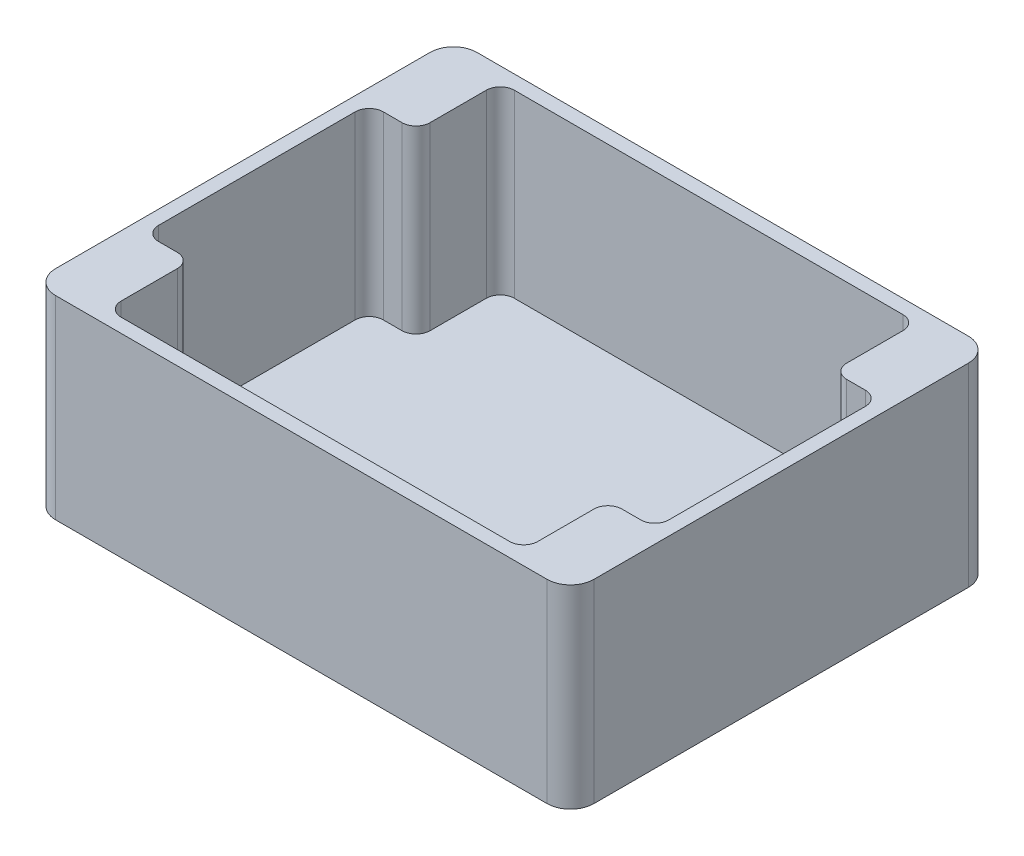
ISO-10303-21;
HEADER;
FILE_DESCRIPTION(('STEP AP214'),'2;1');
FILE_NAME('part.step','',(''),(''),'','','');
FILE_SCHEMA(('AUTOMOTIVE_DESIGN { 1 0 10303 214 1 1 1 1 }'));
ENDSEC;
DATA;
#1=APPLICATION_CONTEXT('core data for automotive mechanical design processes');
#2=APPLICATION_PROTOCOL_DEFINITION('international standard','automotive_design',2000,#1);
#3=PRODUCT_CONTEXT('',#1,'mechanical');
#4=PRODUCT('Part','Part','',(#3));
#5=PRODUCT_RELATED_PRODUCT_CATEGORY('part','',(#4));
#6=PRODUCT_DEFINITION_FORMATION('','',#4);
#7=PRODUCT_DEFINITION_CONTEXT('part definition',#1,'design');
#8=PRODUCT_DEFINITION('design','',#6,#7);
#9=PRODUCT_DEFINITION_SHAPE('','',#8);
#10=(LENGTH_UNIT() NAMED_UNIT(*) SI_UNIT(.MILLI.,.METRE.));
#11=(NAMED_UNIT(*) PLANE_ANGLE_UNIT() SI_UNIT($,.RADIAN.));
#12=(NAMED_UNIT(*) SI_UNIT($,.STERADIAN.) SOLID_ANGLE_UNIT());
#13=UNCERTAINTY_MEASURE_WITH_UNIT(LENGTH_MEASURE(1.E-05),#10,'distance_accuracy_value','');
#14=(GEOMETRIC_REPRESENTATION_CONTEXT(3) GLOBAL_UNCERTAINTY_ASSIGNED_CONTEXT((#13)) GLOBAL_UNIT_ASSIGNED_CONTEXT((#10,
#11,#12)) REPRESENTATION_CONTEXT('',''));
#15=CARTESIAN_POINT('',(0.,0.,0.));
#16=DIRECTION('',(0.,0.,1.));
#17=DIRECTION('',(1.,0.,0.));
#18=AXIS2_PLACEMENT_3D('',#15,#16,#17);
#19=CARTESIAN_POINT('',(0.,3.,0.));
#20=DIRECTION('',(0.,-1.,0.));
#21=DIRECTION('',(0.,0.,-1.));
#22=AXIS2_PLACEMENT_3D('',#19,#20,#21);
#23=PLANE('',#22);
#24=DIRECTION('',(-1.,0.,0.));
#25=VECTOR('',#24,1.);
#26=CARTESIAN_POINT('',(112.,3.,-21.));
#27=LINE('',#26,#25);
#28=CARTESIAN_POINT('',(109.,3.,-21.));
#29=VERTEX_POINT('',#28);
#30=CARTESIAN_POINT('',(105.,3.,-21.));
#31=VERTEX_POINT('',#30);
#32=EDGE_CURVE('E268',#29,#31,#27,.T.);
#33=ORIENTED_EDGE('',*,*,#32,.F.);
#34=CARTESIAN_POINT('',(109.,3.,-24.));
#35=DIRECTION('',(0.,-1.,0.));
#36=DIRECTION('',(0.,0.,-1.));
#37=AXIS2_PLACEMENT_3D('',#34,#35,#36);
#38=CIRCLE('',#37,3.);
#39=CARTESIAN_POINT('',(112.,3.,-24.));
#40=VERTEX_POINT('',#39);
#41=EDGE_CURVE('E507',#29,#40,#38,.F.);
#42=ORIENTED_EDGE('',*,*,#41,.T.);
#43=DIRECTION('',(0.,0.,-1.));
#44=VECTOR('',#43,1.);
#45=CARTESIAN_POINT('',(112.,3.,-3.));
#46=LINE('',#45,#44);
#47=CARTESIAN_POINT('',(112.,3.,-66.));
#48=VERTEX_POINT('',#47);
#49=EDGE_CURVE('E580',#40,#48,#46,.T.);
#50=ORIENTED_EDGE('',*,*,#49,.T.);
#51=CARTESIAN_POINT('',(109.,3.,-66.));
#52=DIRECTION('',(0.,-1.,0.));
#53=DIRECTION('',(0.,0.,-1.));
#54=AXIS2_PLACEMENT_3D('',#51,#52,#53);
#55=CIRCLE('',#54,3.);
#56=CARTESIAN_POINT('',(109.,3.,-69.));
#57=VERTEX_POINT('',#56);
#58=EDGE_CURVE('E495',#48,#57,#55,.F.);
#59=ORIENTED_EDGE('',*,*,#58,.T.);
#60=DIRECTION('',(1.,0.,0.));
#61=VECTOR('',#60,1.);
#62=CARTESIAN_POINT('',(112.,3.,-69.));
#63=LINE('',#62,#61);
#64=CARTESIAN_POINT('',(105.,3.,-69.));
#65=VERTEX_POINT('',#64);
#66=EDGE_CURVE('E542',#65,#57,#63,.T.);
#67=ORIENTED_EDGE('',*,*,#66,.F.);
#68=CARTESIAN_POINT('',(105.,3.,-72.));
#69=DIRECTION('',(0.,-1.,0.));
#70=DIRECTION('',(0.,0.,-1.));
#71=AXIS2_PLACEMENT_3D('',#68,#69,#70);
#72=CIRCLE('',#71,3.);
#73=CARTESIAN_POINT('',(102.,3.,-72.));
#74=VERTEX_POINT('',#73);
#75=EDGE_CURVE('E382',#65,#74,#72,.T.);
#76=ORIENTED_EDGE('',*,*,#75,.T.);
#77=DIRECTION('',(0.,0.,1.));
#78=VECTOR('',#77,1.);
#79=CARTESIAN_POINT('',(102.,3.,-87.));
#80=LINE('',#79,#78);
#81=CARTESIAN_POINT('',(102.,3.,-84.));
#82=VERTEX_POINT('',#81);
#83=EDGE_CURVE('E548',#82,#74,#80,.T.);
#84=ORIENTED_EDGE('',*,*,#83,.F.);
#85=CARTESIAN_POINT('',(99.,3.,-84.));
#86=DIRECTION('',(0.,-1.,0.));
#87=DIRECTION('',(0.,0.,-1.));
#88=AXIS2_PLACEMENT_3D('',#85,#86,#87);
#89=CIRCLE('',#88,3.);
#90=CARTESIAN_POINT('',(99.,3.,-87.));
#91=VERTEX_POINT('',#90);
#92=EDGE_CURVE('E492',#82,#91,#89,.F.);
#93=ORIENTED_EDGE('',*,*,#92,.T.);
#94=DIRECTION('',(-1.,0.,0.));
#95=VECTOR('',#94,1.);
#96=CARTESIAN_POINT('',(112.,3.,-87.));
#97=LINE('',#96,#95);
#98=CARTESIAN_POINT('',(16.,3.,-87.));
#99=VERTEX_POINT('',#98);
#100=EDGE_CURVE('E595',#91,#99,#97,.T.);
#101=ORIENTED_EDGE('',*,*,#100,.T.);
#102=CARTESIAN_POINT('',(16.,3.,-84.));
#103=DIRECTION('',(0.,-1.,0.));
#104=DIRECTION('',(0.,0.,-1.));
#105=AXIS2_PLACEMENT_3D('',#102,#103,#104);
#106=CIRCLE('',#105,3.);
#107=CARTESIAN_POINT('',(13.,3.,-84.));
#108=VERTEX_POINT('',#107);
#109=EDGE_CURVE('E489',#99,#108,#106,.F.);
#110=ORIENTED_EDGE('',*,*,#109,.T.);
#111=DIRECTION('',(0.,0.,-1.));
#112=VECTOR('',#111,1.);
#113=CARTESIAN_POINT('',(13.,3.,-87.));
#114=LINE('',#113,#112);
#115=CARTESIAN_POINT('',(13.,3.,-72.));
#116=VERTEX_POINT('',#115);
#117=EDGE_CURVE('E558',#116,#108,#114,.T.);
#118=ORIENTED_EDGE('',*,*,#117,.F.);
#119=CARTESIAN_POINT('',(10.,3.,-72.));
#120=DIRECTION('',(0.,-1.,0.));
#121=DIRECTION('',(0.,0.,-1.));
#122=AXIS2_PLACEMENT_3D('',#119,#120,#121);
#123=CIRCLE('',#122,3.);
#124=CARTESIAN_POINT('',(10.,3.,-69.));
#125=VERTEX_POINT('',#124);
#126=EDGE_CURVE('E394',#116,#125,#123,.T.);
#127=ORIENTED_EDGE('',*,*,#126,.T.);
#128=DIRECTION('',(1.,0.,0.));
#129=VECTOR('',#128,1.);
#130=CARTESIAN_POINT('',(3.,3.,-69.));
#131=LINE('',#130,#129);
#132=CARTESIAN_POINT('',(6.,3.,-69.));
#133=VERTEX_POINT('',#132);
#134=EDGE_CURVE('E553',#133,#125,#131,.T.);
#135=ORIENTED_EDGE('',*,*,#134,.F.);
#136=CARTESIAN_POINT('',(6.,3.,-66.));
#137=DIRECTION('',(0.,-1.,0.));
#138=DIRECTION('',(0.,0.,-1.));
#139=AXIS2_PLACEMENT_3D('',#136,#137,#138);
#140=CIRCLE('',#139,3.);
#141=CARTESIAN_POINT('',(3.,3.,-66.));
#142=VERTEX_POINT('',#141);
#143=EDGE_CURVE('E486',#133,#142,#140,.F.);
#144=ORIENTED_EDGE('',*,*,#143,.T.);
#145=DIRECTION('',(0.,0.,1.));
#146=VECTOR('',#145,1.);
#147=CARTESIAN_POINT('',(3.,3.,-87.));
#148=LINE('',#147,#146);
#149=CARTESIAN_POINT('',(3.,3.,-24.));
#150=VERTEX_POINT('',#149);
#151=EDGE_CURVE('E599',#142,#150,#148,.T.);
#152=ORIENTED_EDGE('',*,*,#151,.T.);
#153=CARTESIAN_POINT('',(6.,3.,-24.));
#154=DIRECTION('',(0.,-1.,0.));
#155=DIRECTION('',(0.,0.,-1.));
#156=AXIS2_PLACEMENT_3D('',#153,#154,#155);
#157=CIRCLE('',#156,3.);
#158=CARTESIAN_POINT('',(6.,3.,-21.));
#159=VERTEX_POINT('',#158);
#160=EDGE_CURVE('E498',#150,#159,#157,.F.);
#161=ORIENTED_EDGE('',*,*,#160,.T.);
#162=DIRECTION('',(-1.,0.,0.));
#163=VECTOR('',#162,1.);
#164=CARTESIAN_POINT('',(3.,3.,-21.));
#165=LINE('',#164,#163);
#166=CARTESIAN_POINT('',(10.,3.,-21.));
#167=VERTEX_POINT('',#166);
#168=EDGE_CURVE('E733',#167,#159,#165,.T.);
#169=ORIENTED_EDGE('',*,*,#168,.F.);
#170=CARTESIAN_POINT('',(10.,3.,-18.));
#171=DIRECTION('',(0.,-1.,0.));
#172=DIRECTION('',(0.,0.,-1.));
#173=AXIS2_PLACEMENT_3D('',#170,#171,#172);
#174=CIRCLE('',#173,3.);
#175=CARTESIAN_POINT('',(13.,3.,-18.));
#176=VERTEX_POINT('',#175);
#177=EDGE_CURVE('E376',#167,#176,#174,.T.);
#178=ORIENTED_EDGE('',*,*,#177,.T.);
#179=DIRECTION('',(0.,0.,-1.));
#180=VECTOR('',#179,1.);
#181=CARTESIAN_POINT('',(13.,3.,-3.));
#182=LINE('',#181,#180);
#183=CARTESIAN_POINT('',(13.,3.,-6.));
#184=VERTEX_POINT('',#183);
#185=EDGE_CURVE('E285',#184,#176,#182,.T.);
#186=ORIENTED_EDGE('',*,*,#185,.F.);
#187=CARTESIAN_POINT('',(16.,3.,-6.));
#188=DIRECTION('',(0.,-1.,0.));
#189=DIRECTION('',(0.,0.,-1.));
#190=AXIS2_PLACEMENT_3D('',#187,#188,#189);
#191=CIRCLE('',#190,3.);
#192=CARTESIAN_POINT('',(16.,3.,-3.));
#193=VERTEX_POINT('',#192);
#194=EDGE_CURVE('E501',#184,#193,#191,.F.);
#195=ORIENTED_EDGE('',*,*,#194,.T.);
#196=DIRECTION('',(1.,0.,0.));
#197=VECTOR('',#196,1.);
#198=CARTESIAN_POINT('',(3.,3.,-3.));
#199=LINE('',#198,#197);
#200=CARTESIAN_POINT('',(99.,3.,-3.));
#201=VERTEX_POINT('',#200);
#202=EDGE_CURVE('E478',#193,#201,#199,.T.);
#203=ORIENTED_EDGE('',*,*,#202,.T.);
#204=CARTESIAN_POINT('',(99.,3.,-6.));
#205=DIRECTION('',(0.,-1.,0.));
#206=DIRECTION('',(0.,0.,-1.));
#207=AXIS2_PLACEMENT_3D('',#204,#205,#206);
#208=CIRCLE('',#207,3.);
#209=CARTESIAN_POINT('',(102.,3.,-6.));
#210=VERTEX_POINT('',#209);
#211=EDGE_CURVE('E504',#201,#210,#208,.F.);
#212=ORIENTED_EDGE('',*,*,#211,.T.);
#213=DIRECTION('',(0.,0.,1.));
#214=VECTOR('',#213,1.);
#215=CARTESIAN_POINT('',(102.,3.,-3.));
#216=LINE('',#215,#214);
#217=CARTESIAN_POINT('',(102.,3.,-18.));
#218=VERTEX_POINT('',#217);
#219=EDGE_CURVE('E754',#218,#210,#216,.T.);
#220=ORIENTED_EDGE('',*,*,#219,.F.);
#221=CARTESIAN_POINT('',(105.,3.,-18.));
#222=DIRECTION('',(0.,-1.,0.));
#223=DIRECTION('',(0.,0.,-1.));
#224=AXIS2_PLACEMENT_3D('',#221,#222,#223);
#225=CIRCLE('',#224,3.);
#226=EDGE_CURVE('E364',#218,#31,#225,.T.);
#227=ORIENTED_EDGE('',*,*,#226,.T.);
#228=EDGE_LOOP('',(#33,#42,#50,#59,#67,#76,#84,#93,#101,#110,#118,#127,#135,#144,#152,#161,#169,
#178,#186,#195,#203,#212,#220,#227));
#229=FACE_BOUND('',#228,.T.);
#230=ADVANCED_FACE('F49',(#229),#23,.F.);
#231=CARTESIAN_POINT('',(3.,-137.611772752189,-3.));
#232=DIRECTION('',(0.,0.,1.));
#233=DIRECTION('',(1.,0.,0.));
#234=AXIS2_PLACEMENT_3D('',#231,#232,#233);
#235=PLANE('',#234);
#236=DIRECTION('',(1.,0.,0.));
#237=VECTOR('',#236,1.);
#238=CARTESIAN_POINT('',(3.,41.5,-3.));
#239=LINE('',#238,#237);
#240=CARTESIAN_POINT('',(16.,41.5,-3.));
#241=VERTEX_POINT('',#240);
#242=CARTESIAN_POINT('',(99.,41.5,-3.));
#243=VERTEX_POINT('',#242);
#244=EDGE_CURVE('E571',#241,#243,#239,.T.);
#245=ORIENTED_EDGE('',*,*,#244,.T.);
#246=DIRECTION('',(0.,-1.,0.));
#247=VECTOR('',#246,1.);
#248=CARTESIAN_POINT('',(99.,3.,-3.));
#249=LINE('',#248,#247);
#250=EDGE_CURVE('E297',#243,#201,#249,.T.);
#251=ORIENTED_EDGE('',*,*,#250,.T.);
#252=ORIENTED_EDGE('',*,*,#202,.F.);
#253=DIRECTION('',(0.,-1.,0.));
#254=VECTOR('',#253,1.);
#255=CARTESIAN_POINT('',(16.,41.5,-3.));
#256=LINE('',#255,#254);
#257=EDGE_CURVE('E292',#193,#241,#256,.F.);
#258=ORIENTED_EDGE('',*,*,#257,.T.);
#259=EDGE_LOOP('',(#245,#251,#252,#258));
#260=FACE_BOUND('',#259,.T.);
#261=ADVANCED_FACE('F638',(#260),#235,.F.);
#262=CARTESIAN_POINT('',(3.,-137.611772752189,-87.));
#263=DIRECTION('',(-1.,0.,0.));
#264=DIRECTION('',(0.,0.,1.));
#265=AXIS2_PLACEMENT_3D('',#262,#263,#264);
#266=PLANE('',#265);
#267=DIRECTION('',(0.,0.,1.));
#268=VECTOR('',#267,1.);
#269=CARTESIAN_POINT('',(3.,41.5,-87.));
#270=LINE('',#269,#268);
#271=CARTESIAN_POINT('',(3.,41.5,-66.));
#272=VERTEX_POINT('',#271);
#273=CARTESIAN_POINT('',(3.,41.5,-24.));
#274=VERTEX_POINT('',#273);
#275=EDGE_CURVE('E576',#272,#274,#270,.T.);
#276=ORIENTED_EDGE('',*,*,#275,.T.);
#277=DIRECTION('',(0.,-1.,0.));
#278=VECTOR('',#277,1.);
#279=CARTESIAN_POINT('',(3.,3.,-24.));
#280=LINE('',#279,#278);
#281=EDGE_CURVE('E316',#274,#150,#280,.T.);
#282=ORIENTED_EDGE('',*,*,#281,.T.);
#283=ORIENTED_EDGE('',*,*,#151,.F.);
#284=DIRECTION('',(0.,-1.,0.));
#285=VECTOR('',#284,1.);
#286=CARTESIAN_POINT('',(3.,41.5,-66.));
#287=LINE('',#286,#285);
#288=EDGE_CURVE('E313',#142,#272,#287,.F.);
#289=ORIENTED_EDGE('',*,*,#288,.T.);
#290=EDGE_LOOP('',(#276,#282,#283,#289));
#291=FACE_BOUND('',#290,.T.);
#292=ADVANCED_FACE('F643',(#291),#266,.F.);
#293=CARTESIAN_POINT('',(112.,-137.611772752189,-3.));
#294=DIRECTION('',(1.,0.,0.));
#295=DIRECTION('',(0.,0.,-1.));
#296=AXIS2_PLACEMENT_3D('',#293,#294,#295);
#297=PLANE('',#296);
#298=ORIENTED_EDGE('',*,*,#49,.F.);
#299=DIRECTION('',(0.,-1.,0.));
#300=VECTOR('',#299,1.);
#301=CARTESIAN_POINT('',(112.,41.5,-24.));
#302=LINE('',#301,#300);
#303=CARTESIAN_POINT('',(112.,41.5,-24.));
#304=VERTEX_POINT('',#303);
#305=EDGE_CURVE('E514',#40,#304,#302,.F.);
#306=ORIENTED_EDGE('',*,*,#305,.T.);
#307=DIRECTION('',(0.,0.,-1.));
#308=VECTOR('',#307,1.);
#309=CARTESIAN_POINT('',(112.,41.5,-3.));
#310=LINE('',#309,#308);
#311=CARTESIAN_POINT('',(112.,41.5,-66.));
#312=VERTEX_POINT('',#311);
#313=EDGE_CURVE('E585',#304,#312,#310,.T.);
#314=ORIENTED_EDGE('',*,*,#313,.T.);
#315=DIRECTION('',(0.,-1.,0.));
#316=VECTOR('',#315,1.);
#317=CARTESIAN_POINT('',(112.,3.,-66.));
#318=LINE('',#317,#316);
#319=EDGE_CURVE('E510',#312,#48,#318,.T.);
#320=ORIENTED_EDGE('',*,*,#319,.T.);
#321=EDGE_LOOP('',(#298,#306,#314,#320));
#322=FACE_BOUND('',#321,.T.);
#323=ADVANCED_FACE('F648',(#322),#297,.F.);
#324=CARTESIAN_POINT('',(112.,-137.611772752189,-87.));
#325=DIRECTION('',(0.,0.,-1.));
#326=DIRECTION('',(-1.,0.,0.));
#327=AXIS2_PLACEMENT_3D('',#324,#325,#326);
#328=PLANE('',#327);
#329=ORIENTED_EDGE('',*,*,#100,.F.);
#330=DIRECTION('',(0.,-1.,0.));
#331=VECTOR('',#330,1.);
#332=CARTESIAN_POINT('',(99.,41.5,-87.));
#333=LINE('',#332,#331);
#334=CARTESIAN_POINT('',(99.,41.5,-87.));
#335=VERTEX_POINT('',#334);
#336=EDGE_CURVE('E345',#91,#335,#333,.F.);
#337=ORIENTED_EDGE('',*,*,#336,.T.);
#338=DIRECTION('',(-1.,0.,0.));
#339=VECTOR('',#338,1.);
#340=CARTESIAN_POINT('',(112.,41.5,-87.));
#341=LINE('',#340,#339);
#342=CARTESIAN_POINT('',(16.,41.5,-87.));
#343=VERTEX_POINT('',#342);
#344=EDGE_CURVE('E581',#335,#343,#341,.T.);
#345=ORIENTED_EDGE('',*,*,#344,.T.);
#346=DIRECTION('',(0.,-1.,0.));
#347=VECTOR('',#346,1.);
#348=CARTESIAN_POINT('',(16.,3.,-87.));
#349=LINE('',#348,#347);
#350=EDGE_CURVE('E341',#343,#99,#349,.T.);
#351=ORIENTED_EDGE('',*,*,#350,.T.);
#352=EDGE_LOOP('',(#329,#337,#345,#351));
#353=FACE_BOUND('',#352,.T.);
#354=ADVANCED_FACE('F662',(#353),#328,.F.);
#355=CARTESIAN_POINT('',(0.,41.5,0.));
#356=DIRECTION('',(1.,0.,0.));
#357=DIRECTION('',(0.,0.,-1.));
#358=AXIS2_PLACEMENT_3D('',#355,#356,#357);
#359=PLANE('',#358);
#360=DIRECTION('',(0.,0.,1.));
#361=VECTOR('',#360,1.);
#362=CARTESIAN_POINT('',(0.,0.,0.));
#363=LINE('',#362,#361);
#364=CARTESIAN_POINT('',(0.,0.,-85.));
#365=VERTEX_POINT('',#364);
#366=CARTESIAN_POINT('',(0.,0.,-5.));
#367=VERTEX_POINT('',#366);
#368=EDGE_CURVE('E450',#365,#367,#363,.T.);
#369=ORIENTED_EDGE('',*,*,#368,.T.);
#370=DIRECTION('',(0.,-1.,0.));
#371=VECTOR('',#370,1.);
#372=CARTESIAN_POINT('',(0.,41.5,-5.));
#373=LINE('',#372,#371);
#374=CARTESIAN_POINT('',(0.,41.5,-5.));
#375=VERTEX_POINT('',#374);
#376=EDGE_CURVE('E438',#367,#375,#373,.F.);
#377=ORIENTED_EDGE('',*,*,#376,.T.);
#378=DIRECTION('',(0.,0.,1.));
#379=VECTOR('',#378,1.);
#380=CARTESIAN_POINT('',(0.,41.5,0.));
#381=LINE('',#380,#379);
#382=CARTESIAN_POINT('',(0.,41.5,-85.));
#383=VERTEX_POINT('',#382);
#384=EDGE_CURVE('E447',#383,#375,#381,.T.);
#385=ORIENTED_EDGE('',*,*,#384,.F.);
#386=DIRECTION('',(0.,-1.,0.));
#387=VECTOR('',#386,1.);
#388=CARTESIAN_POINT('',(0.,41.5,-85.));
#389=LINE('',#388,#387);
#390=EDGE_CURVE('E434',#383,#365,#389,.T.);
#391=ORIENTED_EDGE('',*,*,#390,.T.);
#392=EDGE_LOOP('',(#369,#377,#385,#391));
#393=FACE_BOUND('',#392,.T.);
#394=ADVANCED_FACE('F446',(#393),#359,.F.);
#395=CARTESIAN_POINT('',(0.,41.5,0.));
#396=DIRECTION('',(0.,0.,-1.));
#397=DIRECTION('',(-1.,0.,0.));
#398=AXIS2_PLACEMENT_3D('',#395,#396,#397);
#399=PLANE('',#398);
#400=DIRECTION('',(1.,0.,0.));
#401=VECTOR('',#400,1.);
#402=CARTESIAN_POINT('',(0.,0.,0.));
#403=LINE('',#402,#401);
#404=CARTESIAN_POINT('',(5.,0.,0.));
#405=VERTEX_POINT('',#404);
#406=CARTESIAN_POINT('',(110.,0.,0.));
#407=VERTEX_POINT('',#406);
#408=EDGE_CURVE('E466',#405,#407,#403,.T.);
#409=ORIENTED_EDGE('',*,*,#408,.T.);
#410=DIRECTION('',(0.,-1.,0.));
#411=VECTOR('',#410,1.);
#412=CARTESIAN_POINT('',(110.,41.5,0.));
#413=LINE('',#412,#411);
#414=CARTESIAN_POINT('',(110.,41.5,0.));
#415=VERTEX_POINT('',#414);
#416=EDGE_CURVE('E420',#407,#415,#413,.F.);
#417=ORIENTED_EDGE('',*,*,#416,.T.);
#418=DIRECTION('',(1.,0.,0.));
#419=VECTOR('',#418,1.);
#420=CARTESIAN_POINT('',(0.,41.5,0.));
#421=LINE('',#420,#419);
#422=CARTESIAN_POINT('',(5.,41.5,0.));
#423=VERTEX_POINT('',#422);
#424=EDGE_CURVE('E457',#423,#415,#421,.T.);
#425=ORIENTED_EDGE('',*,*,#424,.F.);
#426=DIRECTION('',(0.,-1.,0.));
#427=VECTOR('',#426,1.);
#428=CARTESIAN_POINT('',(5.,41.5,0.));
#429=LINE('',#428,#427);
#430=EDGE_CURVE('E416',#423,#405,#429,.T.);
#431=ORIENTED_EDGE('',*,*,#430,.T.);
#432=EDGE_LOOP('',(#409,#417,#425,#431));
#433=FACE_BOUND('',#432,.T.);
#434=ADVANCED_FACE('F465',(#433),#399,.F.);
#435=CARTESIAN_POINT('',(115.,41.5,0.));
#436=DIRECTION('',(-1.,0.,0.));
#437=DIRECTION('',(0.,0.,1.));
#438=AXIS2_PLACEMENT_3D('',#435,#436,#437);
#439=PLANE('',#438);
#440=DIRECTION('',(0.,0.,-1.));
#441=VECTOR('',#440,1.);
#442=CARTESIAN_POINT('',(115.,41.5,0.));
#443=LINE('',#442,#441);
#444=CARTESIAN_POINT('',(115.,41.5,-5.));
#445=VERTEX_POINT('',#444);
#446=CARTESIAN_POINT('',(115.,41.5,-85.));
#447=VERTEX_POINT('',#446);
#448=EDGE_CURVE('E608',#445,#447,#443,.T.);
#449=ORIENTED_EDGE('',*,*,#448,.F.);
#450=DIRECTION('',(0.,-1.,0.));
#451=VECTOR('',#450,1.);
#452=CARTESIAN_POINT('',(115.,41.5,-5.));
#453=LINE('',#452,#451);
#454=CARTESIAN_POINT('',(115.,0.,-5.));
#455=VERTEX_POINT('',#454);
#456=EDGE_CURVE('E400',#445,#455,#453,.T.);
#457=ORIENTED_EDGE('',*,*,#456,.T.);
#458=DIRECTION('',(0.,0.,-1.));
#459=VECTOR('',#458,1.);
#460=CARTESIAN_POINT('',(115.,0.,0.));
#461=LINE('',#460,#459);
#462=CARTESIAN_POINT('',(115.,0.,-85.));
#463=VERTEX_POINT('',#462);
#464=EDGE_CURVE('E472',#455,#463,#461,.T.);
#465=ORIENTED_EDGE('',*,*,#464,.T.);
#466=DIRECTION('',(0.,-1.,0.));
#467=VECTOR('',#466,1.);
#468=CARTESIAN_POINT('',(115.,41.5,-85.));
#469=LINE('',#468,#467);
#470=EDGE_CURVE('E397',#463,#447,#469,.F.);
#471=ORIENTED_EDGE('',*,*,#470,.T.);
#472=EDGE_LOOP('',(#449,#457,#465,#471));
#473=FACE_BOUND('',#472,.T.);
#474=ADVANCED_FACE('F620',(#473),#439,.F.);
#475=CARTESIAN_POINT('',(0.,41.5,-90.));
#476=DIRECTION('',(0.,0.,1.));
#477=DIRECTION('',(1.,0.,0.));
#478=AXIS2_PLACEMENT_3D('',#475,#476,#477);
#479=PLANE('',#478);
#480=DIRECTION('',(-1.,0.,0.));
#481=VECTOR('',#480,1.);
#482=CARTESIAN_POINT('',(0.,41.5,-90.));
#483=LINE('',#482,#481);
#484=CARTESIAN_POINT('',(110.,41.5,-90.));
#485=VERTEX_POINT('',#484);
#486=CARTESIAN_POINT('',(5.,41.5,-90.));
#487=VERTEX_POINT('',#486);
#488=EDGE_CURVE('E273',#485,#487,#483,.T.);
#489=ORIENTED_EDGE('',*,*,#488,.F.);
#490=DIRECTION('',(0.,-1.,0.));
#491=VECTOR('',#490,1.);
#492=CARTESIAN_POINT('',(110.,41.5,-90.));
#493=LINE('',#492,#491);
#494=CARTESIAN_POINT('',(110.,0.,-90.));
#495=VERTEX_POINT('',#494);
#496=EDGE_CURVE('E12',#485,#495,#493,.T.);
#497=ORIENTED_EDGE('',*,*,#496,.T.);
#498=DIRECTION('',(-1.,0.,0.));
#499=VECTOR('',#498,1.);
#500=CARTESIAN_POINT('',(0.,0.,-90.));
#501=LINE('',#500,#499);
#502=CARTESIAN_POINT('',(5.,0.,-90.));
#503=VERTEX_POINT('',#502);
#504=EDGE_CURVE('E458',#495,#503,#501,.T.);
#505=ORIENTED_EDGE('',*,*,#504,.T.);
#506=DIRECTION('',(0.,-1.,0.));
#507=VECTOR('',#506,1.);
#508=CARTESIAN_POINT('',(5.,41.5,-90.));
#509=LINE('',#508,#507);
#510=EDGE_CURVE('E58',#503,#487,#509,.F.);
#511=ORIENTED_EDGE('',*,*,#510,.T.);
#512=EDGE_LOOP('',(#489,#497,#505,#511));
#513=FACE_BOUND('',#512,.T.);
#514=ADVANCED_FACE('F614',(#513),#479,.F.);
#515=CARTESIAN_POINT('',(0.,41.5,0.));
#516=DIRECTION('',(0.,-1.,0.));
#517=DIRECTION('',(0.,0.,-1.));
#518=AXIS2_PLACEMENT_3D('',#515,#516,#517);
#519=PLANE('',#518);
#520=DIRECTION('',(1.,0.,0.));
#521=VECTOR('',#520,1.);
#522=CARTESIAN_POINT('',(112.,41.5,-21.));
#523=LINE('',#522,#521);
#524=CARTESIAN_POINT('',(105.,41.5,-21.));
#525=VERTEX_POINT('',#524);
#526=CARTESIAN_POINT('',(109.,41.5,-21.));
#527=VERTEX_POINT('',#526);
#528=EDGE_CURVE('E265',#525,#527,#523,.T.);
#529=ORIENTED_EDGE('',*,*,#528,.F.);
#530=CARTESIAN_POINT('',(105.,41.5,-18.));
#531=DIRECTION('',(0.,-1.,0.));
#532=DIRECTION('',(0.,0.,-1.));
#533=AXIS2_PLACEMENT_3D('',#530,#531,#532);
#534=CIRCLE('',#533,3.);
#535=CARTESIAN_POINT('',(102.,41.5,-18.));
#536=VERTEX_POINT('',#535);
#537=EDGE_CURVE('E278',#525,#536,#534,.F.);
#538=ORIENTED_EDGE('',*,*,#537,.T.);
#539=DIRECTION('',(0.,0.,-1.));
#540=VECTOR('',#539,1.);
#541=CARTESIAN_POINT('',(102.,41.5,-3.));
#542=LINE('',#541,#540);
#543=CARTESIAN_POINT('',(102.,41.5,-6.));
#544=VERTEX_POINT('',#543);
#545=EDGE_CURVE('E284',#544,#536,#542,.T.);
#546=ORIENTED_EDGE('',*,*,#545,.F.);
#547=CARTESIAN_POINT('',(99.,41.5,-6.));
#548=DIRECTION('',(0.,-1.,0.));
#549=DIRECTION('',(0.,0.,-1.));
#550=AXIS2_PLACEMENT_3D('',#547,#548,#549);
#551=CIRCLE('',#550,3.);
#552=EDGE_CURVE('E367',#544,#243,#551,.T.);
#553=ORIENTED_EDGE('',*,*,#552,.T.);
#554=ORIENTED_EDGE('',*,*,#244,.F.);
#555=CARTESIAN_POINT('',(16.,41.5,-6.));
#556=DIRECTION('',(0.,-1.,0.));
#557=DIRECTION('',(0.,0.,-1.));
#558=AXIS2_PLACEMENT_3D('',#555,#556,#557);
#559=CIRCLE('',#558,3.);
#560=CARTESIAN_POINT('',(13.,41.5,-6.));
#561=VERTEX_POINT('',#560);
#562=EDGE_CURVE('E370',#241,#561,#559,.T.);
#563=ORIENTED_EDGE('',*,*,#562,.T.);
#564=DIRECTION('',(0.,0.,1.));
#565=VECTOR('',#564,1.);
#566=CARTESIAN_POINT('',(13.,41.5,-3.));
#567=LINE('',#566,#565);
#568=CARTESIAN_POINT('',(13.,41.5,-18.));
#569=VERTEX_POINT('',#568);
#570=EDGE_CURVE('E746',#569,#561,#567,.T.);
#571=ORIENTED_EDGE('',*,*,#570,.F.);
#572=CARTESIAN_POINT('',(10.,41.5,-18.));
#573=DIRECTION('',(0.,-1.,0.));
#574=DIRECTION('',(0.,0.,-1.));
#575=AXIS2_PLACEMENT_3D('',#572,#573,#574);
#576=CIRCLE('',#575,3.);
#577=CARTESIAN_POINT('',(10.,41.5,-21.));
#578=VERTEX_POINT('',#577);
#579=EDGE_CURVE('E293',#569,#578,#576,.F.);
#580=ORIENTED_EDGE('',*,*,#579,.T.);
#581=DIRECTION('',(1.,0.,0.));
#582=VECTOR('',#581,1.);
#583=CARTESIAN_POINT('',(3.,41.5,-21.));
#584=LINE('',#583,#582);
#585=CARTESIAN_POINT('',(6.,41.5,-21.));
#586=VERTEX_POINT('',#585);
#587=EDGE_CURVE('E740',#586,#578,#584,.T.);
#588=ORIENTED_EDGE('',*,*,#587,.F.);
#589=CARTESIAN_POINT('',(6.,41.5,-24.));
#590=DIRECTION('',(0.,-1.,0.));
#591=DIRECTION('',(0.,0.,-1.));
#592=AXIS2_PLACEMENT_3D('',#589,#590,#591);
#593=CIRCLE('',#592,3.);
#594=EDGE_CURVE('E373',#586,#274,#593,.T.);
#595=ORIENTED_EDGE('',*,*,#594,.T.);
#596=ORIENTED_EDGE('',*,*,#275,.F.);
#597=CARTESIAN_POINT('',(6.,41.5,-66.));
#598=DIRECTION('',(0.,-1.,0.));
#599=DIRECTION('',(0.,0.,-1.));
#600=AXIS2_PLACEMENT_3D('',#597,#598,#599);
#601=CIRCLE('',#600,3.);
#602=CARTESIAN_POINT('',(6.,41.5,-69.));
#603=VERTEX_POINT('',#602);
#604=EDGE_CURVE('E391',#272,#603,#601,.T.);
#605=ORIENTED_EDGE('',*,*,#604,.T.);
#606=DIRECTION('',(-1.,0.,0.));
#607=VECTOR('',#606,1.);
#608=CARTESIAN_POINT('',(3.,41.5,-69.));
#609=LINE('',#608,#607);
#610=CARTESIAN_POINT('',(10.,41.5,-69.));
#611=VERTEX_POINT('',#610);
#612=EDGE_CURVE('E568',#611,#603,#609,.T.);
#613=ORIENTED_EDGE('',*,*,#612,.F.);
#614=CARTESIAN_POINT('',(10.,41.5,-72.));
#615=DIRECTION('',(0.,-1.,0.));
#616=DIRECTION('',(0.,0.,-1.));
#617=AXIS2_PLACEMENT_3D('',#614,#615,#616);
#618=CIRCLE('',#617,3.);
#619=CARTESIAN_POINT('',(13.,41.5,-72.));
#620=VERTEX_POINT('',#619);
#621=EDGE_CURVE('E522',#611,#620,#618,.F.);
#622=ORIENTED_EDGE('',*,*,#621,.T.);
#623=DIRECTION('',(0.,0.,1.));
#624=VECTOR('',#623,1.);
#625=CARTESIAN_POINT('',(13.,41.5,-87.));
#626=LINE('',#625,#624);
#627=CARTESIAN_POINT('',(13.,41.5,-84.));
#628=VERTEX_POINT('',#627);
#629=EDGE_CURVE('E564',#628,#620,#626,.T.);
#630=ORIENTED_EDGE('',*,*,#629,.F.);
#631=CARTESIAN_POINT('',(16.,41.5,-84.));
#632=DIRECTION('',(0.,-1.,0.));
#633=DIRECTION('',(0.,0.,-1.));
#634=AXIS2_PLACEMENT_3D('',#631,#632,#633);
#635=CIRCLE('',#634,3.);
#636=EDGE_CURVE('E388',#628,#343,#635,.T.);
#637=ORIENTED_EDGE('',*,*,#636,.T.);
#638=ORIENTED_EDGE('',*,*,#344,.F.);
#639=CARTESIAN_POINT('',(99.,41.5,-84.));
#640=DIRECTION('',(0.,-1.,0.));
#641=DIRECTION('',(0.,0.,-1.));
#642=AXIS2_PLACEMENT_3D('',#639,#640,#641);
#643=CIRCLE('',#642,3.);
#644=CARTESIAN_POINT('',(102.,41.5,-84.));
#645=VERTEX_POINT('',#644);
#646=EDGE_CURVE('E385',#335,#645,#643,.T.);
#647=ORIENTED_EDGE('',*,*,#646,.T.);
#648=DIRECTION('',(0.,0.,-1.));
#649=VECTOR('',#648,1.);
#650=CARTESIAN_POINT('',(102.,41.5,-87.));
#651=LINE('',#650,#649);
#652=CARTESIAN_POINT('',(102.,41.5,-72.));
#653=VERTEX_POINT('',#652);
#654=EDGE_CURVE('E532',#653,#645,#651,.T.);
#655=ORIENTED_EDGE('',*,*,#654,.F.);
#656=CARTESIAN_POINT('',(105.,41.5,-72.));
#657=DIRECTION('',(0.,-1.,0.));
#658=DIRECTION('',(0.,0.,-1.));
#659=AXIS2_PLACEMENT_3D('',#656,#657,#658);
#660=CIRCLE('',#659,3.);
#661=CARTESIAN_POINT('',(105.,41.5,-69.));
#662=VERTEX_POINT('',#661);
#663=EDGE_CURVE('E299',#653,#662,#660,.F.);
#664=ORIENTED_EDGE('',*,*,#663,.T.);
#665=DIRECTION('',(-1.,0.,0.));
#666=VECTOR('',#665,1.);
#667=CARTESIAN_POINT('',(112.,41.5,-69.));
#668=LINE('',#667,#666);
#669=CARTESIAN_POINT('',(109.,41.5,-69.));
#670=VERTEX_POINT('',#669);
#671=EDGE_CURVE('E529',#670,#662,#668,.T.);
#672=ORIENTED_EDGE('',*,*,#671,.F.);
#673=CARTESIAN_POINT('',(109.,41.5,-66.));
#674=DIRECTION('',(0.,-1.,0.));
#675=DIRECTION('',(0.,0.,-1.));
#676=AXIS2_PLACEMENT_3D('',#673,#674,#675);
#677=CIRCLE('',#676,3.);
#678=EDGE_CURVE('E379',#670,#312,#677,.T.);
#679=ORIENTED_EDGE('',*,*,#678,.T.);
#680=ORIENTED_EDGE('',*,*,#313,.F.);
#681=CARTESIAN_POINT('',(109.,41.5,-24.));
#682=DIRECTION('',(0.,-1.,0.));
#683=DIRECTION('',(0.,0.,-1.));
#684=AXIS2_PLACEMENT_3D('',#681,#682,#683);
#685=CIRCLE('',#684,3.);
#686=EDGE_CURVE('E282',#304,#527,#685,.T.);
#687=ORIENTED_EDGE('',*,*,#686,.T.);
#688=EDGE_LOOP('',(#529,#538,#546,#553,#554,#563,#571,#580,#588,#595,#596,#605,#613,#622,#630,
#637,#638,#647,#655,#664,#672,#679,#680,#687));
#689=FACE_BOUND('',#688,.T.);
#690=ORIENTED_EDGE('',*,*,#424,.T.);
#691=CARTESIAN_POINT('',(110.,41.5,-5.));
#692=DIRECTION('',(0.,-1.,0.));
#693=DIRECTION('',(0.,0.,-1.));
#694=AXIS2_PLACEMENT_3D('',#691,#692,#693);
#695=CIRCLE('',#694,5.);
#696=EDGE_CURVE('E431',#415,#445,#695,.F.);
#697=ORIENTED_EDGE('',*,*,#696,.T.);
#698=ORIENTED_EDGE('',*,*,#448,.T.);
#699=CARTESIAN_POINT('',(110.,41.5,-85.));
#700=DIRECTION('',(0.,-1.,0.));
#701=DIRECTION('',(0.,0.,-1.));
#702=AXIS2_PLACEMENT_3D('',#699,#700,#701);
#703=CIRCLE('',#702,5.);
#704=EDGE_CURVE('E71',#447,#485,#703,.F.);
#705=ORIENTED_EDGE('',*,*,#704,.T.);
#706=ORIENTED_EDGE('',*,*,#488,.T.);
#707=CARTESIAN_POINT('',(5.,41.5,-85.));
#708=DIRECTION('',(0.,-1.,0.));
#709=DIRECTION('',(0.,0.,-1.));
#710=AXIS2_PLACEMENT_3D('',#707,#708,#709);
#711=CIRCLE('',#710,5.);
#712=EDGE_CURVE('E423',#487,#383,#711,.F.);
#713=ORIENTED_EDGE('',*,*,#712,.T.);
#714=ORIENTED_EDGE('',*,*,#384,.T.);
#715=CARTESIAN_POINT('',(5.,41.5,-5.));
#716=DIRECTION('',(0.,-1.,0.));
#717=DIRECTION('',(0.,0.,-1.));
#718=AXIS2_PLACEMENT_3D('',#715,#716,#717);
#719=CIRCLE('',#718,5.);
#720=EDGE_CURVE('E428',#375,#423,#719,.F.);
#721=ORIENTED_EDGE('',*,*,#720,.T.);
#722=EDGE_LOOP('',(#690,#697,#698,#705,#706,#713,#714,#721));
#723=FACE_BOUND('',#722,.T.);
#724=ADVANCED_FACE('F276',(#689,#723),#519,.F.);
#725=CARTESIAN_POINT('',(0.,0.,0.));
#726=DIRECTION('',(0.,-1.,0.));
#727=DIRECTION('',(0.,0.,-1.));
#728=AXIS2_PLACEMENT_3D('',#725,#726,#727);
#729=PLANE('',#728);
#730=ORIENTED_EDGE('',*,*,#464,.F.);
#731=CARTESIAN_POINT('',(110.,0.,-5.));
#732=DIRECTION('',(0.,-1.,0.));
#733=DIRECTION('',(0.,0.,-1.));
#734=AXIS2_PLACEMENT_3D('',#731,#732,#733);
#735=CIRCLE('',#734,5.);
#736=EDGE_CURVE('E413',#455,#407,#735,.T.);
#737=ORIENTED_EDGE('',*,*,#736,.T.);
#738=ORIENTED_EDGE('',*,*,#408,.F.);
#739=CARTESIAN_POINT('',(5.,0.,-5.));
#740=DIRECTION('',(0.,-1.,0.));
#741=DIRECTION('',(0.,0.,-1.));
#742=AXIS2_PLACEMENT_3D('',#739,#740,#741);
#743=CIRCLE('',#742,5.);
#744=EDGE_CURVE('E410',#405,#367,#743,.T.);
#745=ORIENTED_EDGE('',*,*,#744,.T.);
#746=ORIENTED_EDGE('',*,*,#368,.F.);
#747=CARTESIAN_POINT('',(5.,0.,-85.));
#748=DIRECTION('',(0.,-1.,0.));
#749=DIRECTION('',(0.,0.,-1.));
#750=AXIS2_PLACEMENT_3D('',#747,#748,#749);
#751=CIRCLE('',#750,5.);
#752=EDGE_CURVE('E404',#365,#503,#751,.T.);
#753=ORIENTED_EDGE('',*,*,#752,.T.);
#754=ORIENTED_EDGE('',*,*,#504,.F.);
#755=CARTESIAN_POINT('',(110.,0.,-85.));
#756=DIRECTION('',(0.,-1.,0.));
#757=DIRECTION('',(0.,0.,-1.));
#758=AXIS2_PLACEMENT_3D('',#755,#756,#757);
#759=CIRCLE('',#758,5.);
#760=EDGE_CURVE('E407',#495,#463,#759,.T.);
#761=ORIENTED_EDGE('',*,*,#760,.T.);
#762=EDGE_LOOP('',(#730,#737,#738,#745,#746,#753,#754,#761));
#763=FACE_BOUND('',#762,.T.);
#764=ADVANCED_FACE('F470',(#763),#729,.T.);
#765=CARTESIAN_POINT('',(13.,62.091260281974,-87.));
#766=DIRECTION('',(-1.,0.,0.));
#767=DIRECTION('',(0.,0.,1.));
#768=AXIS2_PLACEMENT_3D('',#765,#766,#767);
#769=PLANE('',#768);
#770=ORIENTED_EDGE('',*,*,#117,.T.);
#771=DIRECTION('',(0.,-1.,0.));
#772=VECTOR('',#771,1.);
#773=CARTESIAN_POINT('',(13.,41.5,-84.));
#774=LINE('',#773,#772);
#775=EDGE_CURVE('E352',#108,#628,#774,.F.);
#776=ORIENTED_EDGE('',*,*,#775,.T.);
#777=ORIENTED_EDGE('',*,*,#629,.T.);
#778=DIRECTION('',(0.,-1.,0.));
#779=VECTOR('',#778,1.);
#780=CARTESIAN_POINT('',(13.,62.091260281974,-72.));
#781=LINE('',#780,#779);
#782=EDGE_CURVE('E348',#620,#116,#781,.T.);
#783=ORIENTED_EDGE('',*,*,#782,.T.);
#784=EDGE_LOOP('',(#770,#776,#777,#783));
#785=FACE_BOUND('',#784,.T.);
#786=ADVANCED_FACE('F653',(#785),#769,.F.);
#787=CARTESIAN_POINT('',(3.,62.091260281974,-69.));
#788=DIRECTION('',(0.,0.,-1.));
#789=DIRECTION('',(-1.,0.,0.));
#790=AXIS2_PLACEMENT_3D('',#787,#788,#789);
#791=PLANE('',#790);
#792=ORIENTED_EDGE('',*,*,#612,.T.);
#793=DIRECTION('',(0.,-1.,0.));
#794=VECTOR('',#793,1.);
#795=CARTESIAN_POINT('',(6.,3.,-69.));
#796=LINE('',#795,#794);
#797=EDGE_CURVE('E358',#603,#133,#796,.T.);
#798=ORIENTED_EDGE('',*,*,#797,.T.);
#799=ORIENTED_EDGE('',*,*,#134,.T.);
#800=DIRECTION('',(0.,-1.,0.));
#801=VECTOR('',#800,1.);
#802=CARTESIAN_POINT('',(10.,62.091260281974,-69.));
#803=LINE('',#802,#801);
#804=EDGE_CURVE('E355',#125,#611,#803,.F.);
#805=ORIENTED_EDGE('',*,*,#804,.T.);
#806=EDGE_LOOP('',(#792,#798,#799,#805));
#807=FACE_BOUND('',#806,.T.);
#808=ADVANCED_FACE('F711',(#807),#791,.F.);
#809=CARTESIAN_POINT('',(112.,62.091260281974,-69.));
#810=DIRECTION('',(0.,0.,-1.));
#811=DIRECTION('',(-1.,0.,0.));
#812=AXIS2_PLACEMENT_3D('',#809,#810,#811);
#813=PLANE('',#812);
#814=ORIENTED_EDGE('',*,*,#66,.T.);
#815=DIRECTION('',(0.,-1.,0.));
#816=VECTOR('',#815,1.);
#817=CARTESIAN_POINT('',(109.,41.5,-69.));
#818=LINE('',#817,#816);
#819=EDGE_CURVE('E331',#57,#670,#818,.F.);
#820=ORIENTED_EDGE('',*,*,#819,.T.);
#821=ORIENTED_EDGE('',*,*,#671,.T.);
#822=DIRECTION('',(0.,-1.,0.));
#823=VECTOR('',#822,1.);
#824=CARTESIAN_POINT('',(105.,62.091260281974,-69.));
#825=LINE('',#824,#823);
#826=EDGE_CURVE('E327',#662,#65,#825,.T.);
#827=ORIENTED_EDGE('',*,*,#826,.T.);
#828=EDGE_LOOP('',(#814,#820,#821,#827));
#829=FACE_BOUND('',#828,.T.);
#830=ADVANCED_FACE('F538',(#829),#813,.F.);
#831=CARTESIAN_POINT('',(102.,62.091260281974,-87.));
#832=DIRECTION('',(1.,0.,0.));
#833=DIRECTION('',(0.,0.,-1.));
#834=AXIS2_PLACEMENT_3D('',#831,#832,#833);
#835=PLANE('',#834);
#836=ORIENTED_EDGE('',*,*,#83,.T.);
#837=DIRECTION('',(0.,-1.,0.));
#838=VECTOR('',#837,1.);
#839=CARTESIAN_POINT('',(102.,62.091260281974,-72.));
#840=LINE('',#839,#838);
#841=EDGE_CURVE('E338',#74,#653,#840,.F.);
#842=ORIENTED_EDGE('',*,*,#841,.T.);
#843=ORIENTED_EDGE('',*,*,#654,.T.);
#844=DIRECTION('',(0.,-1.,0.));
#845=VECTOR('',#844,1.);
#846=CARTESIAN_POINT('',(102.,3.,-84.));
#847=LINE('',#846,#845);
#848=EDGE_CURVE('E334',#645,#82,#847,.T.);
#849=ORIENTED_EDGE('',*,*,#848,.T.);
#850=EDGE_LOOP('',(#836,#842,#843,#849));
#851=FACE_BOUND('',#850,.T.);
#852=ADVANCED_FACE('F550',(#851),#835,.F.);
#853=CARTESIAN_POINT('',(102.,62.091260281974,-3.));
#854=DIRECTION('',(1.,0.,0.));
#855=DIRECTION('',(0.,0.,-1.));
#856=AXIS2_PLACEMENT_3D('',#853,#854,#855);
#857=PLANE('',#856);
#858=ORIENTED_EDGE('',*,*,#545,.T.);
#859=DIRECTION('',(0.,-1.,0.));
#860=VECTOR('',#859,1.);
#861=CARTESIAN_POINT('',(102.,62.091260281974,-18.));
#862=LINE('',#861,#860);
#863=EDGE_CURVE('E290',#536,#218,#862,.T.);
#864=ORIENTED_EDGE('',*,*,#863,.T.);
#865=ORIENTED_EDGE('',*,*,#219,.T.);
#866=DIRECTION('',(0.,-1.,0.));
#867=VECTOR('',#866,1.);
#868=CARTESIAN_POINT('',(102.,41.5,-6.));
#869=LINE('',#868,#867);
#870=EDGE_CURVE('E517',#210,#544,#869,.F.);
#871=ORIENTED_EDGE('',*,*,#870,.T.);
#872=EDGE_LOOP('',(#858,#864,#865,#871));
#873=FACE_BOUND('',#872,.T.);
#874=ADVANCED_FACE('F762',(#873),#857,.F.);
#875=CARTESIAN_POINT('',(112.,62.091260281974,-21.));
#876=DIRECTION('',(0.,0.,1.));
#877=DIRECTION('',(1.,0.,0.));
#878=AXIS2_PLACEMENT_3D('',#875,#876,#877);
#879=PLANE('',#878);
#880=ORIENTED_EDGE('',*,*,#528,.T.);
#881=DIRECTION('',(0.,-1.,0.));
#882=VECTOR('',#881,1.);
#883=CARTESIAN_POINT('',(109.,3.,-21.));
#884=LINE('',#883,#882);
#885=EDGE_CURVE('E272',#527,#29,#884,.T.);
#886=ORIENTED_EDGE('',*,*,#885,.T.);
#887=ORIENTED_EDGE('',*,*,#32,.T.);
#888=DIRECTION('',(0.,-1.,0.));
#889=VECTOR('',#888,1.);
#890=CARTESIAN_POINT('',(105.,62.091260281974,-21.));
#891=LINE('',#890,#889);
#892=EDGE_CURVE('E261',#31,#525,#891,.F.);
#893=ORIENTED_EDGE('',*,*,#892,.T.);
#894=EDGE_LOOP('',(#880,#886,#887,#893));
#895=FACE_BOUND('',#894,.T.);
#896=ADVANCED_FACE('F263',(#895),#879,.F.);
#897=CARTESIAN_POINT('',(3.,62.091260281974,-21.));
#898=DIRECTION('',(0.,0.,1.));
#899=DIRECTION('',(1.,0.,0.));
#900=AXIS2_PLACEMENT_3D('',#897,#898,#899);
#901=PLANE('',#900);
#902=ORIENTED_EDGE('',*,*,#168,.T.);
#903=DIRECTION('',(0.,-1.,0.));
#904=VECTOR('',#903,1.);
#905=CARTESIAN_POINT('',(6.,41.5,-21.));
#906=LINE('',#905,#904);
#907=EDGE_CURVE('E324',#159,#586,#906,.F.);
#908=ORIENTED_EDGE('',*,*,#907,.T.);
#909=ORIENTED_EDGE('',*,*,#587,.T.);
#910=DIRECTION('',(0.,-1.,0.));
#911=VECTOR('',#910,1.);
#912=CARTESIAN_POINT('',(10.,62.091260281974,-21.));
#913=LINE('',#912,#911);
#914=EDGE_CURVE('E320',#578,#167,#913,.T.);
#915=ORIENTED_EDGE('',*,*,#914,.T.);
#916=EDGE_LOOP('',(#902,#908,#909,#915));
#917=FACE_BOUND('',#916,.T.);
#918=ADVANCED_FACE('F735',(#917),#901,.F.);
#919=CARTESIAN_POINT('',(13.,62.091260281974,-3.));
#920=DIRECTION('',(-1.,0.,0.));
#921=DIRECTION('',(0.,0.,1.));
#922=AXIS2_PLACEMENT_3D('',#919,#920,#921);
#923=PLANE('',#922);
#924=ORIENTED_EDGE('',*,*,#570,.T.);
#925=DIRECTION('',(0.,-1.,0.));
#926=VECTOR('',#925,1.);
#927=CARTESIAN_POINT('',(13.,3.,-6.));
#928=LINE('',#927,#926);
#929=EDGE_CURVE('E309',#561,#184,#928,.T.);
#930=ORIENTED_EDGE('',*,*,#929,.T.);
#931=ORIENTED_EDGE('',*,*,#185,.T.);
#932=DIRECTION('',(0.,-1.,0.));
#933=VECTOR('',#932,1.);
#934=CARTESIAN_POINT('',(13.,62.091260281974,-18.));
#935=LINE('',#934,#933);
#936=EDGE_CURVE('E306',#176,#569,#935,.F.);
#937=ORIENTED_EDGE('',*,*,#936,.T.);
#938=EDGE_LOOP('',(#924,#930,#931,#937));
#939=FACE_BOUND('',#938,.T.);
#940=ADVANCED_FACE('F666',(#939),#923,.F.);
#941=CARTESIAN_POINT('',(109.,62.091260281974,-24.));
#942=DIRECTION('',(0.,1.,0.));
#943=DIRECTION('',(0.,0.,1.));
#944=AXIS2_PLACEMENT_3D('',#941,#942,#943);
#945=CYLINDRICAL_SURFACE('',#944,3.);
#946=ORIENTED_EDGE('',*,*,#686,.F.);
#947=ORIENTED_EDGE('',*,*,#305,.F.);
#948=ORIENTED_EDGE('',*,*,#41,.F.);
#949=ORIENTED_EDGE('',*,*,#885,.F.);
#950=EDGE_LOOP('',(#946,#947,#948,#949));
#951=FACE_BOUND('',#950,.T.);
#952=ADVANCED_FACE('F663',(#951),#945,.F.);
#953=CARTESIAN_POINT('',(105.,62.091260281974,-18.));
#954=DIRECTION('',(0.,-1.,0.));
#955=DIRECTION('',(0.,0.,-1.));
#956=AXIS2_PLACEMENT_3D('',#953,#954,#955);
#957=CYLINDRICAL_SURFACE('',#956,3.);
#958=ORIENTED_EDGE('',*,*,#537,.F.);
#959=ORIENTED_EDGE('',*,*,#892,.F.);
#960=ORIENTED_EDGE('',*,*,#226,.F.);
#961=ORIENTED_EDGE('',*,*,#863,.F.);
#962=EDGE_LOOP('',(#958,#959,#960,#961));
#963=FACE_BOUND('',#962,.T.);
#964=ADVANCED_FACE('F288',(#963),#957,.T.);
#965=CARTESIAN_POINT('',(99.,-137.611772752189,-6.));
#966=DIRECTION('',(0.,1.,0.));
#967=DIRECTION('',(0.,0.,1.));
#968=AXIS2_PLACEMENT_3D('',#965,#966,#967);
#969=CYLINDRICAL_SURFACE('',#968,3.);
#970=ORIENTED_EDGE('',*,*,#552,.F.);
#971=ORIENTED_EDGE('',*,*,#870,.F.);
#972=ORIENTED_EDGE('',*,*,#211,.F.);
#973=ORIENTED_EDGE('',*,*,#250,.F.);
#974=EDGE_LOOP('',(#970,#971,#972,#973));
#975=FACE_BOUND('',#974,.T.);
#976=ADVANCED_FACE('F670',(#975),#969,.F.);
#977=CARTESIAN_POINT('',(16.,62.091260281974,-6.));
#978=DIRECTION('',(0.,1.,0.));
#979=DIRECTION('',(0.,0.,1.));
#980=AXIS2_PLACEMENT_3D('',#977,#978,#979);
#981=CYLINDRICAL_SURFACE('',#980,3.);
#982=ORIENTED_EDGE('',*,*,#562,.F.);
#983=ORIENTED_EDGE('',*,*,#257,.F.);
#984=ORIENTED_EDGE('',*,*,#194,.F.);
#985=ORIENTED_EDGE('',*,*,#929,.F.);
#986=EDGE_LOOP('',(#982,#983,#984,#985));
#987=FACE_BOUND('',#986,.T.);
#988=ADVANCED_FACE('F673',(#987),#981,.F.);
#989=CARTESIAN_POINT('',(6.,-137.611772752189,-24.));
#990=DIRECTION('',(0.,1.,0.));
#991=DIRECTION('',(0.,0.,1.));
#992=AXIS2_PLACEMENT_3D('',#989,#990,#991);
#993=CYLINDRICAL_SURFACE('',#992,3.);
#994=ORIENTED_EDGE('',*,*,#594,.F.);
#995=ORIENTED_EDGE('',*,*,#907,.F.);
#996=ORIENTED_EDGE('',*,*,#160,.F.);
#997=ORIENTED_EDGE('',*,*,#281,.F.);
#998=EDGE_LOOP('',(#994,#995,#996,#997));
#999=FACE_BOUND('',#998,.T.);
#1000=ADVANCED_FACE('F677',(#999),#993,.F.);
#1001=CARTESIAN_POINT('',(10.,62.091260281974,-18.));
#1002=DIRECTION('',(0.,-1.,0.));
#1003=DIRECTION('',(0.,0.,-1.));
#1004=AXIS2_PLACEMENT_3D('',#1001,#1002,#1003);
#1005=CYLINDRICAL_SURFACE('',#1004,3.);
#1006=ORIENTED_EDGE('',*,*,#579,.F.);
#1007=ORIENTED_EDGE('',*,*,#936,.F.);
#1008=ORIENTED_EDGE('',*,*,#177,.F.);
#1009=ORIENTED_EDGE('',*,*,#914,.F.);
#1010=EDGE_LOOP('',(#1006,#1007,#1008,#1009));
#1011=FACE_BOUND('',#1010,.T.);
#1012=ADVANCED_FACE('F681',(#1011),#1005,.T.);
#1013=CARTESIAN_POINT('',(109.,-137.611772752189,-66.));
#1014=DIRECTION('',(0.,1.,0.));
#1015=DIRECTION('',(0.,0.,1.));
#1016=AXIS2_PLACEMENT_3D('',#1013,#1014,#1015);
#1017=CYLINDRICAL_SURFACE('',#1016,3.);
#1018=ORIENTED_EDGE('',*,*,#678,.F.);
#1019=ORIENTED_EDGE('',*,*,#819,.F.);
#1020=ORIENTED_EDGE('',*,*,#58,.F.);
#1021=ORIENTED_EDGE('',*,*,#319,.F.);
#1022=EDGE_LOOP('',(#1018,#1019,#1020,#1021));
#1023=FACE_BOUND('',#1022,.T.);
#1024=ADVANCED_FACE('F685',(#1023),#1017,.F.);
#1025=CARTESIAN_POINT('',(105.,62.091260281974,-72.));
#1026=DIRECTION('',(0.,-1.,0.));
#1027=DIRECTION('',(0.,0.,-1.));
#1028=AXIS2_PLACEMENT_3D('',#1025,#1026,#1027);
#1029=CYLINDRICAL_SURFACE('',#1028,3.);
#1030=ORIENTED_EDGE('',*,*,#663,.F.);
#1031=ORIENTED_EDGE('',*,*,#841,.F.);
#1032=ORIENTED_EDGE('',*,*,#75,.F.);
#1033=ORIENTED_EDGE('',*,*,#826,.F.);
#1034=EDGE_LOOP('',(#1030,#1031,#1032,#1033));
#1035=FACE_BOUND('',#1034,.T.);
#1036=ADVANCED_FACE('F544',(#1035),#1029,.T.);
#1037=CARTESIAN_POINT('',(99.,62.091260281974,-84.));
#1038=DIRECTION('',(0.,1.,0.));
#1039=DIRECTION('',(0.,0.,1.));
#1040=AXIS2_PLACEMENT_3D('',#1037,#1038,#1039);
#1041=CYLINDRICAL_SURFACE('',#1040,3.);
#1042=ORIENTED_EDGE('',*,*,#646,.F.);
#1043=ORIENTED_EDGE('',*,*,#336,.F.);
#1044=ORIENTED_EDGE('',*,*,#92,.F.);
#1045=ORIENTED_EDGE('',*,*,#848,.F.);
#1046=EDGE_LOOP('',(#1042,#1043,#1044,#1045));
#1047=FACE_BOUND('',#1046,.T.);
#1048=ADVANCED_FACE('F692',(#1047),#1041,.F.);
#1049=CARTESIAN_POINT('',(16.,-137.611772752189,-84.));
#1050=DIRECTION('',(0.,1.,0.));
#1051=DIRECTION('',(0.,0.,1.));
#1052=AXIS2_PLACEMENT_3D('',#1049,#1050,#1051);
#1053=CYLINDRICAL_SURFACE('',#1052,3.);
#1054=ORIENTED_EDGE('',*,*,#636,.F.);
#1055=ORIENTED_EDGE('',*,*,#775,.F.);
#1056=ORIENTED_EDGE('',*,*,#109,.F.);
#1057=ORIENTED_EDGE('',*,*,#350,.F.);
#1058=EDGE_LOOP('',(#1054,#1055,#1056,#1057));
#1059=FACE_BOUND('',#1058,.T.);
#1060=ADVANCED_FACE('F695',(#1059),#1053,.F.);
#1061=CARTESIAN_POINT('',(6.,62.091260281974,-66.));
#1062=DIRECTION('',(0.,1.,0.));
#1063=DIRECTION('',(0.,0.,1.));
#1064=AXIS2_PLACEMENT_3D('',#1061,#1062,#1063);
#1065=CYLINDRICAL_SURFACE('',#1064,3.);
#1066=ORIENTED_EDGE('',*,*,#604,.F.);
#1067=ORIENTED_EDGE('',*,*,#288,.F.);
#1068=ORIENTED_EDGE('',*,*,#143,.F.);
#1069=ORIENTED_EDGE('',*,*,#797,.F.);
#1070=EDGE_LOOP('',(#1066,#1067,#1068,#1069));
#1071=FACE_BOUND('',#1070,.T.);
#1072=ADVANCED_FACE('F634',(#1071),#1065,.F.);
#1073=CARTESIAN_POINT('',(10.,62.091260281974,-72.));
#1074=DIRECTION('',(0.,-1.,0.));
#1075=DIRECTION('',(0.,0.,-1.));
#1076=AXIS2_PLACEMENT_3D('',#1073,#1074,#1075);
#1077=CYLINDRICAL_SURFACE('',#1076,3.);
#1078=ORIENTED_EDGE('',*,*,#621,.F.);
#1079=ORIENTED_EDGE('',*,*,#804,.F.);
#1080=ORIENTED_EDGE('',*,*,#126,.F.);
#1081=ORIENTED_EDGE('',*,*,#782,.F.);
#1082=EDGE_LOOP('',(#1078,#1079,#1080,#1081));
#1083=FACE_BOUND('',#1082,.T.);
#1084=ADVANCED_FACE('F626',(#1083),#1077,.T.);
#1085=CARTESIAN_POINT('',(110.,41.5,-5.));
#1086=DIRECTION('',(0.,-1.,0.));
#1087=DIRECTION('',(0.,0.,-1.));
#1088=AXIS2_PLACEMENT_3D('',#1085,#1086,#1087);
#1089=CYLINDRICAL_SURFACE('',#1088,5.);
#1090=ORIENTED_EDGE('',*,*,#696,.F.);
#1091=ORIENTED_EDGE('',*,*,#416,.F.);
#1092=ORIENTED_EDGE('',*,*,#736,.F.);
#1093=ORIENTED_EDGE('',*,*,#456,.F.);
#1094=EDGE_LOOP('',(#1090,#1091,#1092,#1093));
#1095=FACE_BOUND('',#1094,.T.);
#1096=ADVANCED_FACE('F624',(#1095),#1089,.T.);
#1097=CARTESIAN_POINT('',(5.,41.5,-5.));
#1098=DIRECTION('',(0.,-1.,0.));
#1099=DIRECTION('',(0.,0.,-1.));
#1100=AXIS2_PLACEMENT_3D('',#1097,#1098,#1099);
#1101=CYLINDRICAL_SURFACE('',#1100,5.);
#1102=ORIENTED_EDGE('',*,*,#720,.F.);
#1103=ORIENTED_EDGE('',*,*,#376,.F.);
#1104=ORIENTED_EDGE('',*,*,#744,.F.);
#1105=ORIENTED_EDGE('',*,*,#430,.F.);
#1106=EDGE_LOOP('',(#1102,#1103,#1104,#1105));
#1107=FACE_BOUND('',#1106,.T.);
#1108=ADVANCED_FACE('F461',(#1107),#1101,.T.);
#1109=CARTESIAN_POINT('',(110.,41.5,-85.));
#1110=DIRECTION('',(0.,-1.,0.));
#1111=DIRECTION('',(0.,0.,-1.));
#1112=AXIS2_PLACEMENT_3D('',#1109,#1110,#1111);
#1113=CYLINDRICAL_SURFACE('',#1112,5.);
#1114=ORIENTED_EDGE('',*,*,#704,.F.);
#1115=ORIENTED_EDGE('',*,*,#470,.F.);
#1116=ORIENTED_EDGE('',*,*,#760,.F.);
#1117=ORIENTED_EDGE('',*,*,#496,.F.);
#1118=EDGE_LOOP('',(#1114,#1115,#1116,#1117));
#1119=FACE_BOUND('',#1118,.T.);
#1120=ADVANCED_FACE('F616',(#1119),#1113,.T.);
#1121=CARTESIAN_POINT('',(5.,41.5,-85.));
#1122=DIRECTION('',(0.,-1.,0.));
#1123=DIRECTION('',(0.,0.,-1.));
#1124=AXIS2_PLACEMENT_3D('',#1121,#1122,#1123);
#1125=CYLINDRICAL_SURFACE('',#1124,5.);
#1126=ORIENTED_EDGE('',*,*,#712,.F.);
#1127=ORIENTED_EDGE('',*,*,#510,.F.);
#1128=ORIENTED_EDGE('',*,*,#752,.F.);
#1129=ORIENTED_EDGE('',*,*,#390,.F.);
#1130=EDGE_LOOP('',(#1126,#1127,#1128,#1129));
#1131=FACE_BOUND('',#1130,.T.);
#1132=ADVANCED_FACE('F51',(#1131),#1125,.T.);
#1133=CLOSED_SHELL('',(#230,#261,#292,#323,#354,#394,#434,#474,#514,#724,#764,#786,#808,#830,
#852,#874,#896,#918,#940,#952,#964,#976,#988,#1000,#1012,#1024,#1036,#1048,#1060,#1072,#1084,
#1096,#1108,#1120,#1132));
#1134=MANIFOLD_SOLID_BREP('B2',#1133);
#1135=ADVANCED_BREP_SHAPE_REPRESENTATION('',(#18,#1134),#14);
#1136=SHAPE_DEFINITION_REPRESENTATION(#9,#1135);
ENDSEC;
END-ISO-10303-21;
